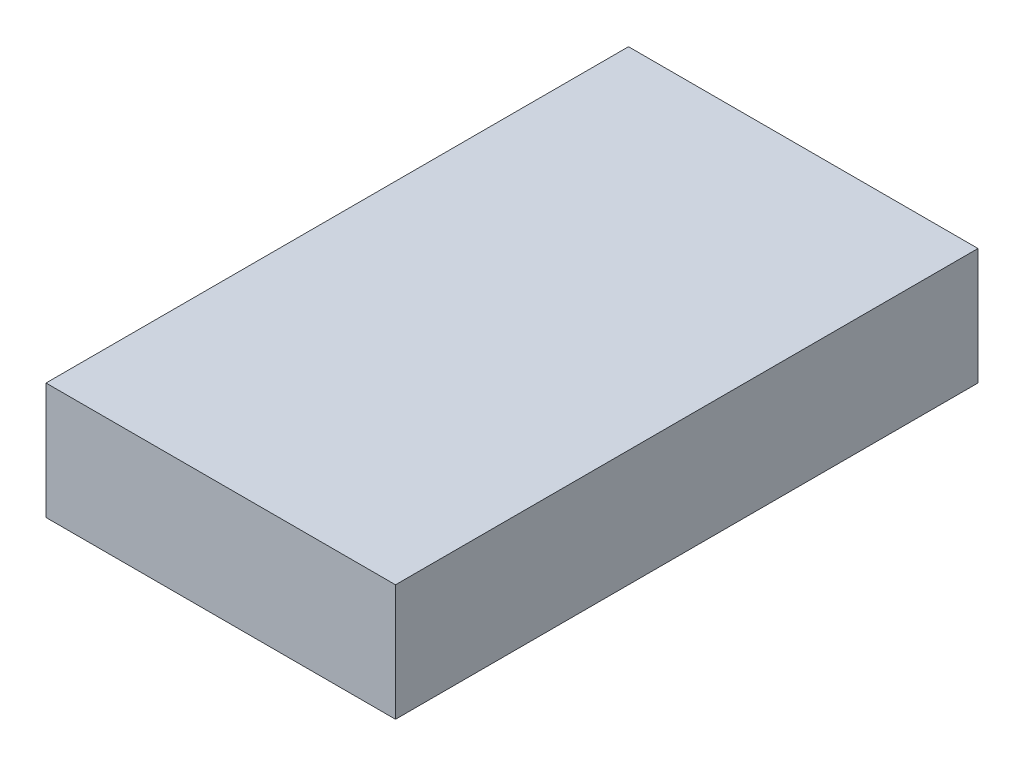
ISO-10303-21;
HEADER;
FILE_DESCRIPTION(('STEP AP214'),'2;1');
FILE_NAME('part.step','',(''),(''),'','','');
FILE_SCHEMA(('AUTOMOTIVE_DESIGN { 1 0 10303 214 1 1 1 1 }'));
ENDSEC;
DATA;
#1=APPLICATION_CONTEXT('core data for automotive mechanical design processes');
#2=APPLICATION_PROTOCOL_DEFINITION('international standard','automotive_design',2000,#1);
#3=PRODUCT_CONTEXT('',#1,'mechanical');
#4=PRODUCT('Part','Part','',(#3));
#5=PRODUCT_RELATED_PRODUCT_CATEGORY('part','',(#4));
#6=PRODUCT_DEFINITION_FORMATION('','',#4);
#7=PRODUCT_DEFINITION_CONTEXT('part definition',#1,'design');
#8=PRODUCT_DEFINITION('design','',#6,#7);
#9=PRODUCT_DEFINITION_SHAPE('','',#8);
#10=(LENGTH_UNIT() NAMED_UNIT(*) SI_UNIT(.MILLI.,.METRE.));
#11=(NAMED_UNIT(*) PLANE_ANGLE_UNIT() SI_UNIT($,.RADIAN.));
#12=(NAMED_UNIT(*) SI_UNIT($,.STERADIAN.) SOLID_ANGLE_UNIT());
#13=UNCERTAINTY_MEASURE_WITH_UNIT(LENGTH_MEASURE(1.E-05),#10,'distance_accuracy_value','');
#14=(GEOMETRIC_REPRESENTATION_CONTEXT(3) GLOBAL_UNCERTAINTY_ASSIGNED_CONTEXT((#13)) GLOBAL_UNIT_ASSIGNED_CONTEXT((#10,
#11,#12)) REPRESENTATION_CONTEXT('',''));
#15=CARTESIAN_POINT('',(0.,0.,0.));
#16=DIRECTION('',(0.,0.,1.));
#17=DIRECTION('',(1.,0.,0.));
#18=AXIS2_PLACEMENT_3D('',#15,#16,#17);
#19=CARTESIAN_POINT('',(5.69999876,1.90000128,0.));
#20=DIRECTION('',(0.,-1.,0.));
#21=DIRECTION('',(0.,0.,-1.));
#22=AXIS2_PLACEMENT_3D('',#19,#20,#21);
#23=PLANE('',#22);
#24=DIRECTION('',(0.,0.,-1.));
#25=VECTOR('',#24,1.);
#26=CARTESIAN_POINT('',(-5.69999876,1.90000128,0.));
#27=LINE('',#26,#25);
#28=CARTESIAN_POINT('',(-5.69999876,1.90000128,0.));
#29=VERTEX_POINT('',#28);
#30=CARTESIAN_POINT('',(-5.69999876,1.90000128,19.0000001));
#31=VERTEX_POINT('',#30);
#32=EDGE_CURVE('E20',#29,#31,#27,.F.);
#33=ORIENTED_EDGE('',*,*,#32,.T.);
#34=DIRECTION('',(-1.,0.,0.));
#35=VECTOR('',#34,1.);
#36=CARTESIAN_POINT('',(-5.69999876,1.90000128,19.0000001));
#37=LINE('',#36,#35);
#38=CARTESIAN_POINT('',(5.69999876,1.90000128,19.0000001));
#39=VERTEX_POINT('',#38);
#40=EDGE_CURVE('E55',#31,#39,#37,.F.);
#41=ORIENTED_EDGE('',*,*,#40,.T.);
#42=DIRECTION('',(0.,0.,1.));
#43=VECTOR('',#42,1.);
#44=CARTESIAN_POINT('',(5.69999876,1.90000128,0.));
#45=LINE('',#44,#43);
#46=CARTESIAN_POINT('',(5.69999876,1.90000128,0.));
#47=VERTEX_POINT('',#46);
#48=EDGE_CURVE('E76',#39,#47,#45,.F.);
#49=ORIENTED_EDGE('',*,*,#48,.T.);
#50=DIRECTION('',(-1.,0.,0.));
#51=VECTOR('',#50,1.);
#52=CARTESIAN_POINT('',(-5.69999876,1.90000128,0.));
#53=LINE('',#52,#51);
#54=EDGE_CURVE('E58',#29,#47,#53,.F.);
#55=ORIENTED_EDGE('',*,*,#54,.F.);
#56=EDGE_LOOP('',(#33,#41,#49,#55));
#57=FACE_BOUND('',#56,.T.);
#58=ADVANCED_FACE('F17',(#57),#23,.F.);
#59=CARTESIAN_POINT('',(-5.69999876,1.90000128,0.));
#60=DIRECTION('',(1.,0.,0.));
#61=DIRECTION('',(0.,0.,-1.));
#62=AXIS2_PLACEMENT_3D('',#59,#60,#61);
#63=PLANE('',#62);
#64=DIRECTION('',(0.,0.,1.));
#65=VECTOR('',#64,1.);
#66=CARTESIAN_POINT('',(-5.69999876,-1.90000128,0.));
#67=LINE('',#66,#65);
#68=CARTESIAN_POINT('',(-5.69999876,-1.90000128,0.));
#69=VERTEX_POINT('',#68);
#70=CARTESIAN_POINT('',(-5.69999876,-1.90000128,19.0000001));
#71=VERTEX_POINT('',#70);
#72=EDGE_CURVE('E73',#69,#71,#67,.T.);
#73=ORIENTED_EDGE('',*,*,#72,.T.);
#74=DIRECTION('',(0.,1.,0.));
#75=VECTOR('',#74,1.);
#76=CARTESIAN_POINT('',(-5.69999876,-1.90000128,19.0000001));
#77=LINE('',#76,#75);
#78=EDGE_CURVE('E63',#71,#31,#77,.T.);
#79=ORIENTED_EDGE('',*,*,#78,.T.);
#80=ORIENTED_EDGE('',*,*,#32,.F.);
#81=DIRECTION('',(0.,1.,0.));
#82=VECTOR('',#81,1.);
#83=CARTESIAN_POINT('',(-5.69999876,-1.90000128,0.));
#84=LINE('',#83,#82);
#85=EDGE_CURVE('E78',#69,#29,#84,.T.);
#86=ORIENTED_EDGE('',*,*,#85,.F.);
#87=EDGE_LOOP('',(#73,#79,#80,#86));
#88=FACE_BOUND('',#87,.T.);
#89=ADVANCED_FACE('F72',(#88),#63,.F.);
#90=CARTESIAN_POINT('',(-5.69999876,-1.90000128,19.0000001));
#91=DIRECTION('',(0.,0.,-1.));
#92=DIRECTION('',(-1.,0.,0.));
#93=AXIS2_PLACEMENT_3D('',#90,#91,#92);
#94=PLANE('',#93);
#95=DIRECTION('',(0.,1.,0.));
#96=VECTOR('',#95,1.);
#97=CARTESIAN_POINT('',(5.69999876,-1.90000128,19.0000001));
#98=LINE('',#97,#96);
#99=CARTESIAN_POINT('',(5.69999876,-1.90000128,19.0000001));
#100=VERTEX_POINT('',#99);
#101=EDGE_CURVE('E69',#100,#39,#98,.T.);
#102=ORIENTED_EDGE('',*,*,#101,.T.);
#103=ORIENTED_EDGE('',*,*,#40,.F.);
#104=ORIENTED_EDGE('',*,*,#78,.F.);
#105=DIRECTION('',(1.,0.,0.));
#106=VECTOR('',#105,1.);
#107=CARTESIAN_POINT('',(-5.69999876,-1.90000128,19.0000001));
#108=LINE('',#107,#106);
#109=EDGE_CURVE('E83',#71,#100,#108,.T.);
#110=ORIENTED_EDGE('',*,*,#109,.T.);
#111=EDGE_LOOP('',(#102,#103,#104,#110));
#112=FACE_BOUND('',#111,.T.);
#113=ADVANCED_FACE('F66',(#112),#94,.F.);
#114=CARTESIAN_POINT('',(5.69999876,-1.90000128,0.));
#115=DIRECTION('',(-1.,0.,0.));
#116=DIRECTION('',(0.,0.,1.));
#117=AXIS2_PLACEMENT_3D('',#114,#115,#116);
#118=PLANE('',#117);
#119=ORIENTED_EDGE('',*,*,#48,.F.);
#120=ORIENTED_EDGE('',*,*,#101,.F.);
#121=DIRECTION('',(0.,0.,1.));
#122=VECTOR('',#121,1.);
#123=CARTESIAN_POINT('',(5.69999876,-1.90000128,0.));
#124=LINE('',#123,#122);
#125=CARTESIAN_POINT('',(5.69999876,-1.90000128,0.));
#126=VERTEX_POINT('',#125);
#127=EDGE_CURVE('E26',#100,#126,#124,.F.);
#128=ORIENTED_EDGE('',*,*,#127,.T.);
#129=DIRECTION('',(0.,1.,0.));
#130=VECTOR('',#129,1.);
#131=CARTESIAN_POINT('',(5.69999876,-1.90000128,0.));
#132=LINE('',#131,#130);
#133=EDGE_CURVE('E34',#47,#126,#132,.F.);
#134=ORIENTED_EDGE('',*,*,#133,.F.);
#135=EDGE_LOOP('',(#119,#120,#128,#134));
#136=FACE_BOUND('',#135,.T.);
#137=ADVANCED_FACE('F88',(#136),#118,.F.);
#138=CARTESIAN_POINT('',(-5.69999876,-1.90000128,0.));
#139=DIRECTION('',(0.,0.,-1.));
#140=DIRECTION('',(-1.,0.,0.));
#141=AXIS2_PLACEMENT_3D('',#138,#139,#140);
#142=PLANE('',#141);
#143=ORIENTED_EDGE('',*,*,#133,.T.);
#144=DIRECTION('',(1.,0.,0.));
#145=VECTOR('',#144,1.);
#146=CARTESIAN_POINT('',(-5.69999876,-1.90000128,0.));
#147=LINE('',#146,#145);
#148=EDGE_CURVE('E11',#126,#69,#147,.F.);
#149=ORIENTED_EDGE('',*,*,#148,.T.);
#150=ORIENTED_EDGE('',*,*,#85,.T.);
#151=ORIENTED_EDGE('',*,*,#54,.T.);
#152=EDGE_LOOP('',(#143,#149,#150,#151));
#153=FACE_BOUND('',#152,.T.);
#154=ADVANCED_FACE('F91',(#153),#142,.T.);
#155=CARTESIAN_POINT('',(-5.69999876,-1.90000128,0.));
#156=DIRECTION('',(0.,1.,0.));
#157=DIRECTION('',(0.,0.,1.));
#158=AXIS2_PLACEMENT_3D('',#155,#156,#157);
#159=PLANE('',#158);
#160=ORIENTED_EDGE('',*,*,#127,.F.);
#161=ORIENTED_EDGE('',*,*,#109,.F.);
#162=ORIENTED_EDGE('',*,*,#72,.F.);
#163=ORIENTED_EDGE('',*,*,#148,.F.);
#164=EDGE_LOOP('',(#160,#161,#162,#163));
#165=FACE_BOUND('',#164,.T.);
#166=ADVANCED_FACE('F90',(#165),#159,.F.);
#167=CLOSED_SHELL('',(#58,#89,#113,#137,#154,#166));
#168=MANIFOLD_SOLID_BREP('B1',#167);
#169=ADVANCED_BREP_SHAPE_REPRESENTATION('',(#18,#168),#14);
#170=SHAPE_DEFINITION_REPRESENTATION(#9,#169);
ENDSEC;
END-ISO-10303-21;
